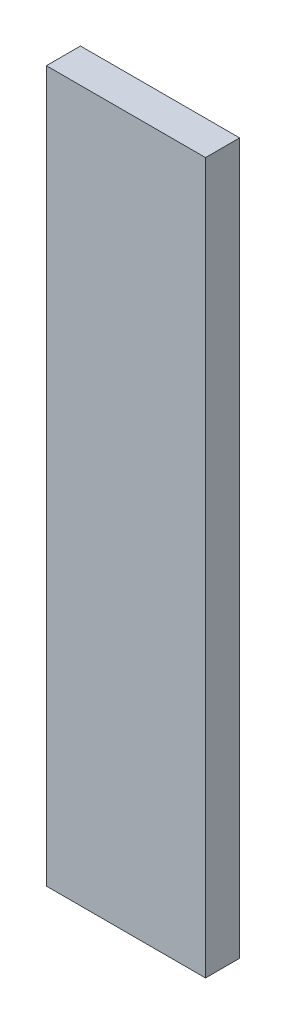
ISO-10303-21;
HEADER;
FILE_DESCRIPTION(('STEP AP214'),'2;1');
FILE_NAME('part.step','',(''),(''),'','','');
FILE_SCHEMA(('AUTOMOTIVE_DESIGN { 1 0 10303 214 1 1 1 1 }'));
ENDSEC;
DATA;
#1=APPLICATION_CONTEXT('core data for automotive mechanical design processes');
#2=APPLICATION_PROTOCOL_DEFINITION('international standard','automotive_design',2000,#1);
#3=PRODUCT_CONTEXT('',#1,'mechanical');
#4=PRODUCT('Part','Part','',(#3));
#5=PRODUCT_RELATED_PRODUCT_CATEGORY('part','',(#4));
#6=PRODUCT_DEFINITION_FORMATION('','',#4);
#7=PRODUCT_DEFINITION_CONTEXT('part definition',#1,'design');
#8=PRODUCT_DEFINITION('design','',#6,#7);
#9=PRODUCT_DEFINITION_SHAPE('','',#8);
#10=(LENGTH_UNIT() NAMED_UNIT(*) SI_UNIT(.MILLI.,.METRE.));
#11=(NAMED_UNIT(*) PLANE_ANGLE_UNIT() SI_UNIT($,.RADIAN.));
#12=(NAMED_UNIT(*) SI_UNIT($,.STERADIAN.) SOLID_ANGLE_UNIT());
#13=UNCERTAINTY_MEASURE_WITH_UNIT(LENGTH_MEASURE(1.E-05),#10,'distance_accuracy_value','');
#14=(GEOMETRIC_REPRESENTATION_CONTEXT(3) GLOBAL_UNCERTAINTY_ASSIGNED_CONTEXT((#13)) GLOBAL_UNIT_ASSIGNED_CONTEXT((#10,
#11,#12)) REPRESENTATION_CONTEXT('',''));
#15=CARTESIAN_POINT('',(0.,0.,0.));
#16=DIRECTION('',(0.,0.,1.));
#17=DIRECTION('',(1.,0.,0.));
#18=AXIS2_PLACEMENT_3D('',#15,#16,#17);
#19=CARTESIAN_POINT('',(0.,0.,6.));
#20=DIRECTION('',(1.,0.,0.));
#21=DIRECTION('',(0.,0.,-1.));
#22=AXIS2_PLACEMENT_3D('',#19,#20,#21);
#23=PLANE('',#22);
#24=DIRECTION('',(0.,-1.,0.));
#25=VECTOR('',#24,1.);
#26=CARTESIAN_POINT('',(0.,0.,0.));
#27=LINE('',#26,#25);
#28=CARTESIAN_POINT('',(0.,125.,0.));
#29=VERTEX_POINT('',#28);
#30=CARTESIAN_POINT('',(0.,0.,0.));
#31=VERTEX_POINT('',#30);
#32=EDGE_CURVE('E95',#29,#31,#27,.T.);
#33=ORIENTED_EDGE('',*,*,#32,.T.);
#34=DIRECTION('',(0.,0.,-1.));
#35=VECTOR('',#34,1.);
#36=CARTESIAN_POINT('',(0.,0.,6.));
#37=LINE('',#36,#35);
#38=CARTESIAN_POINT('',(0.,0.,6.));
#39=VERTEX_POINT('',#38);
#40=EDGE_CURVE('E11',#39,#31,#37,.T.);
#41=ORIENTED_EDGE('',*,*,#40,.F.);
#42=DIRECTION('',(0.,-1.,0.));
#43=VECTOR('',#42,1.);
#44=CARTESIAN_POINT('',(0.,0.,6.));
#45=LINE('',#44,#43);
#46=CARTESIAN_POINT('',(0.,125.,6.));
#47=VERTEX_POINT('',#46);
#48=EDGE_CURVE('E83',#47,#39,#45,.T.);
#49=ORIENTED_EDGE('',*,*,#48,.F.);
#50=DIRECTION('',(0.,0.,-1.));
#51=VECTOR('',#50,1.);
#52=CARTESIAN_POINT('',(0.,125.,6.));
#53=LINE('',#52,#51);
#54=EDGE_CURVE('E91',#47,#29,#53,.T.);
#55=ORIENTED_EDGE('',*,*,#54,.T.);
#56=EDGE_LOOP('',(#33,#41,#49,#55));
#57=FACE_BOUND('',#56,.T.);
#58=ADVANCED_FACE('F32',(#57),#23,.F.);
#59=CARTESIAN_POINT('',(0.,0.,6.));
#60=DIRECTION('',(0.,1.,0.));
#61=DIRECTION('',(0.,0.,1.));
#62=AXIS2_PLACEMENT_3D('',#59,#60,#61);
#63=PLANE('',#62);
#64=DIRECTION('',(1.,0.,0.));
#65=VECTOR('',#64,1.);
#66=CARTESIAN_POINT('',(0.,0.,0.));
#67=LINE('',#66,#65);
#68=CARTESIAN_POINT('',(28.,0.,0.));
#69=VERTEX_POINT('',#68);
#70=EDGE_CURVE('E87',#31,#69,#67,.T.);
#71=ORIENTED_EDGE('',*,*,#70,.T.);
#72=DIRECTION('',(0.,0.,-1.));
#73=VECTOR('',#72,1.);
#74=CARTESIAN_POINT('',(28.,0.,6.));
#75=LINE('',#74,#73);
#76=CARTESIAN_POINT('',(28.,0.,6.));
#77=VERTEX_POINT('',#76);
#78=EDGE_CURVE('E40',#77,#69,#75,.T.);
#79=ORIENTED_EDGE('',*,*,#78,.F.);
#80=DIRECTION('',(1.,0.,0.));
#81=VECTOR('',#80,1.);
#82=CARTESIAN_POINT('',(0.,0.,6.));
#83=LINE('',#82,#81);
#84=EDGE_CURVE('E78',#39,#77,#83,.T.);
#85=ORIENTED_EDGE('',*,*,#84,.F.);
#86=ORIENTED_EDGE('',*,*,#40,.T.);
#87=EDGE_LOOP('',(#71,#79,#85,#86));
#88=FACE_BOUND('',#87,.T.);
#89=ADVANCED_FACE('F86',(#88),#63,.F.);
#90=CARTESIAN_POINT('',(28.,0.,6.));
#91=DIRECTION('',(-1.,0.,0.));
#92=DIRECTION('',(0.,0.,1.));
#93=AXIS2_PLACEMENT_3D('',#90,#91,#92);
#94=PLANE('',#93);
#95=DIRECTION('',(0.,1.,0.));
#96=VECTOR('',#95,1.);
#97=CARTESIAN_POINT('',(28.,0.,0.));
#98=LINE('',#97,#96);
#99=CARTESIAN_POINT('',(28.,125.,0.));
#100=VERTEX_POINT('',#99);
#101=EDGE_CURVE('E65',#69,#100,#98,.T.);
#102=ORIENTED_EDGE('',*,*,#101,.T.);
#103=DIRECTION('',(0.,0.,-1.));
#104=VECTOR('',#103,1.);
#105=CARTESIAN_POINT('',(28.,125.,6.));
#106=LINE('',#105,#104);
#107=CARTESIAN_POINT('',(28.,125.,6.));
#108=VERTEX_POINT('',#107);
#109=EDGE_CURVE('E88',#108,#100,#106,.T.);
#110=ORIENTED_EDGE('',*,*,#109,.F.);
#111=DIRECTION('',(0.,1.,0.));
#112=VECTOR('',#111,1.);
#113=CARTESIAN_POINT('',(28.,0.,6.));
#114=LINE('',#113,#112);
#115=EDGE_CURVE('E81',#77,#108,#114,.T.);
#116=ORIENTED_EDGE('',*,*,#115,.F.);
#117=ORIENTED_EDGE('',*,*,#78,.T.);
#118=EDGE_LOOP('',(#102,#110,#116,#117));
#119=FACE_BOUND('',#118,.T.);
#120=ADVANCED_FACE('F89',(#119),#94,.F.);
#121=CARTESIAN_POINT('',(0.,125.,6.));
#122=DIRECTION('',(0.,-1.,0.));
#123=DIRECTION('',(0.,0.,-1.));
#124=AXIS2_PLACEMENT_3D('',#121,#122,#123);
#125=PLANE('',#124);
#126=DIRECTION('',(-1.,0.,0.));
#127=VECTOR('',#126,1.);
#128=CARTESIAN_POINT('',(0.,125.,0.));
#129=LINE('',#128,#127);
#130=EDGE_CURVE('E71',#100,#29,#129,.T.);
#131=ORIENTED_EDGE('',*,*,#130,.T.);
#132=ORIENTED_EDGE('',*,*,#54,.F.);
#133=DIRECTION('',(-1.,0.,0.));
#134=VECTOR('',#133,1.);
#135=CARTESIAN_POINT('',(0.,125.,6.));
#136=LINE('',#135,#134);
#137=EDGE_CURVE('E48',#108,#47,#136,.T.);
#138=ORIENTED_EDGE('',*,*,#137,.F.);
#139=ORIENTED_EDGE('',*,*,#109,.T.);
#140=EDGE_LOOP('',(#131,#132,#138,#139));
#141=FACE_BOUND('',#140,.T.);
#142=ADVANCED_FACE('F102',(#141),#125,.F.);
#143=CARTESIAN_POINT('',(0.,0.,6.));
#144=DIRECTION('',(0.,0.,-1.));
#145=DIRECTION('',(-1.,0.,0.));
#146=AXIS2_PLACEMENT_3D('',#143,#144,#145);
#147=PLANE('',#146);
#148=ORIENTED_EDGE('',*,*,#48,.T.);
#149=ORIENTED_EDGE('',*,*,#84,.T.);
#150=ORIENTED_EDGE('',*,*,#115,.T.);
#151=ORIENTED_EDGE('',*,*,#137,.T.);
#152=EDGE_LOOP('',(#148,#149,#150,#151));
#153=FACE_BOUND('',#152,.T.);
#154=ADVANCED_FACE('F79',(#153),#147,.F.);
#155=CARTESIAN_POINT('',(0.,0.,0.));
#156=DIRECTION('',(0.,0.,-1.));
#157=DIRECTION('',(-1.,0.,0.));
#158=AXIS2_PLACEMENT_3D('',#155,#156,#157);
#159=PLANE('',#158);
#160=ORIENTED_EDGE('',*,*,#32,.F.);
#161=ORIENTED_EDGE('',*,*,#130,.F.);
#162=ORIENTED_EDGE('',*,*,#101,.F.);
#163=ORIENTED_EDGE('',*,*,#70,.F.);
#164=EDGE_LOOP('',(#160,#161,#162,#163));
#165=FACE_BOUND('',#164,.T.);
#166=ADVANCED_FACE('F105',(#165),#159,.T.);
#167=CLOSED_SHELL('',(#58,#89,#120,#142,#154,#166));
#168=MANIFOLD_SOLID_BREP('B2',#167);
#169=ADVANCED_BREP_SHAPE_REPRESENTATION('',(#18,#168),#14);
#170=SHAPE_DEFINITION_REPRESENTATION(#9,#169);
ENDSEC;
END-ISO-10303-21;
